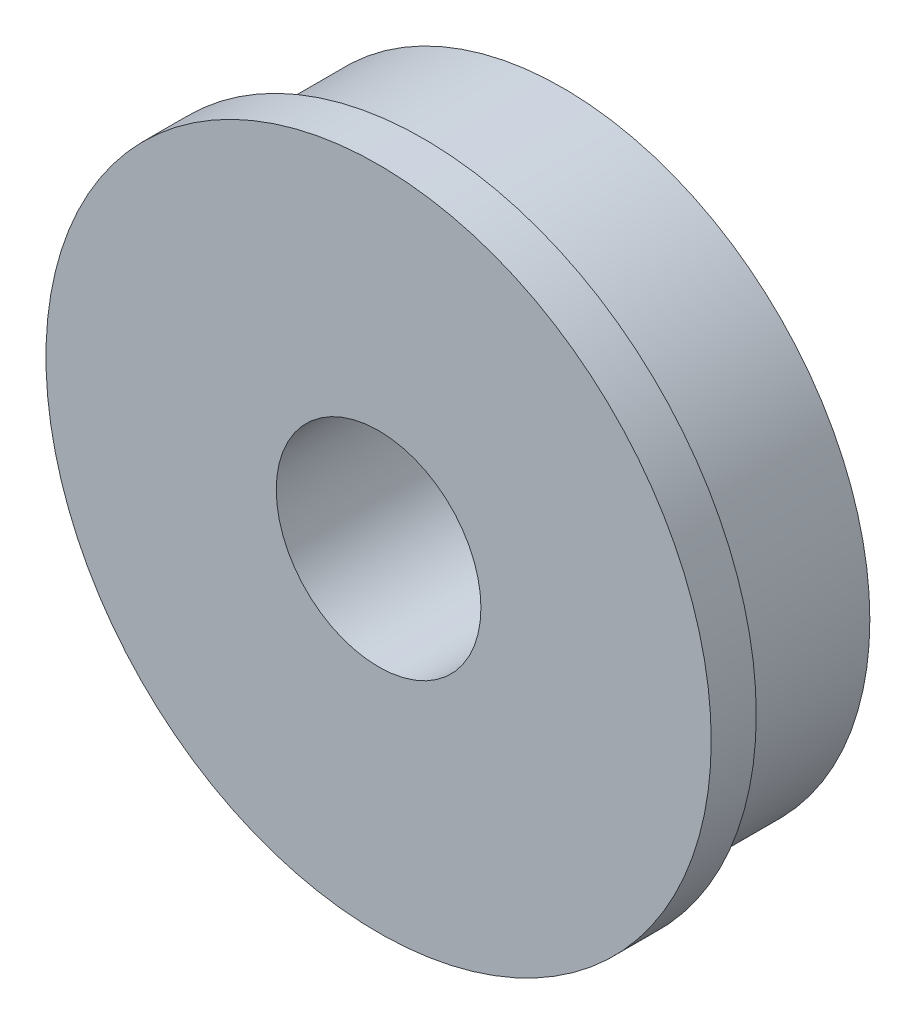
ISO-10303-21;
HEADER;
FILE_DESCRIPTION(('STEP AP214'),'2;1');
FILE_NAME('part.step','',(''),(''),'','','');
FILE_SCHEMA(('AUTOMOTIVE_DESIGN { 1 0 10303 214 1 1 1 1 }'));
ENDSEC;
DATA;
#1=APPLICATION_CONTEXT('core data for automotive mechanical design processes');
#2=APPLICATION_PROTOCOL_DEFINITION('international standard','automotive_design',2000,#1);
#3=PRODUCT_CONTEXT('',#1,'mechanical');
#4=PRODUCT('Part','Part','',(#3));
#5=PRODUCT_RELATED_PRODUCT_CATEGORY('part','',(#4));
#6=PRODUCT_DEFINITION_FORMATION('','',#4);
#7=PRODUCT_DEFINITION_CONTEXT('part definition',#1,'design');
#8=PRODUCT_DEFINITION('design','',#6,#7);
#9=PRODUCT_DEFINITION_SHAPE('','',#8);
#10=(LENGTH_UNIT() NAMED_UNIT(*) SI_UNIT(.MILLI.,.METRE.));
#11=(NAMED_UNIT(*) PLANE_ANGLE_UNIT() SI_UNIT($,.RADIAN.));
#12=(NAMED_UNIT(*) SI_UNIT($,.STERADIAN.) SOLID_ANGLE_UNIT());
#13=UNCERTAINTY_MEASURE_WITH_UNIT(LENGTH_MEASURE(1.E-05),#10,'distance_accuracy_value','');
#14=(GEOMETRIC_REPRESENTATION_CONTEXT(3) GLOBAL_UNCERTAINTY_ASSIGNED_CONTEXT((#13)) GLOBAL_UNIT_ASSIGNED_CONTEXT((#10,
#11,#12)) REPRESENTATION_CONTEXT('',''));
#15=CARTESIAN_POINT('',(0.,0.,0.));
#16=DIRECTION('',(0.,0.,1.));
#17=DIRECTION('',(1.,0.,0.));
#18=AXIS2_PLACEMENT_3D('',#15,#16,#17);
#19=CARTESIAN_POINT('',(0.,0.,0.));
#20=DIRECTION('',(0.,0.,1.));
#21=DIRECTION('',(1.,0.,0.));
#22=AXIS2_PLACEMENT_3D('',#19,#20,#21);
#23=PLANE('',#22);
#24=CARTESIAN_POINT('',(0.,0.,0.));
#25=DIRECTION('',(0.,0.,1.));
#26=DIRECTION('',(1.,0.,0.));
#27=AXIS2_PLACEMENT_3D('',#24,#25,#26);
#28=CIRCLE('',#27,15.);
#29=CARTESIAN_POINT('',(15.,0.,0.));
#30=VERTEX_POINT('',#29);
#31=EDGE_CURVE('E36',#30,#30,#28,.T.);
#32=ORIENTED_EDGE('',*,*,#31,.F.);
#33=EDGE_LOOP('',(#32));
#34=FACE_BOUND('',#33,.T.);
#35=CARTESIAN_POINT('',(0.,0.,0.));
#36=DIRECTION('',(0.,0.,1.));
#37=DIRECTION('',(1.,0.,0.));
#38=AXIS2_PLACEMENT_3D('',#35,#36,#37);
#39=CIRCLE('',#38,5.);
#40=CARTESIAN_POINT('',(5.,0.,0.));
#41=VERTEX_POINT('',#40);
#42=EDGE_CURVE('E43',#41,#41,#39,.T.);
#43=ORIENTED_EDGE('',*,*,#42,.T.);
#44=EDGE_LOOP('',(#43));
#45=FACE_BOUND('',#44,.T.);
#46=ADVANCED_FACE('F32',(#34,#45),#23,.F.);
#47=CARTESIAN_POINT('',(0.,0.,6.8));
#48=DIRECTION('',(0.,0.,-1.));
#49=DIRECTION('',(-1.,0.,0.));
#50=AXIS2_PLACEMENT_3D('',#47,#48,#49);
#51=CYLINDRICAL_SURFACE('',#50,15.);
#52=CARTESIAN_POINT('',(0.,0.,6.8));
#53=DIRECTION('',(0.,0.,1.));
#54=DIRECTION('',(1.,0.,0.));
#55=AXIS2_PLACEMENT_3D('',#52,#53,#54);
#56=CIRCLE('',#55,15.);
#57=CARTESIAN_POINT('',(15.,0.,6.8));
#58=VERTEX_POINT('',#57);
#59=EDGE_CURVE('E10',#58,#58,#56,.T.);
#60=ORIENTED_EDGE('',*,*,#59,.F.);
#61=EDGE_LOOP('',(#60));
#62=FACE_BOUND('',#61,.T.);
#63=ORIENTED_EDGE('',*,*,#31,.T.);
#64=EDGE_LOOP('',(#63));
#65=FACE_BOUND('',#64,.T.);
#66=ADVANCED_FACE('F34',(#62,#65),#51,.T.);
#67=CARTESIAN_POINT('',(0.,0.,6.8));
#68=DIRECTION('',(0.,0.,-1.));
#69=DIRECTION('',(-1.,0.,0.));
#70=AXIS2_PLACEMENT_3D('',#67,#68,#69);
#71=CYLINDRICAL_SURFACE('',#70,5.);
#72=ORIENTED_EDGE('',*,*,#42,.F.);
#73=EDGE_LOOP('',(#72));
#74=FACE_BOUND('',#73,.T.);
#75=CARTESIAN_POINT('',(0.,0.,9.));
#76=DIRECTION('',(0.,0.,1.));
#77=DIRECTION('',(1.,0.,0.));
#78=AXIS2_PLACEMENT_3D('',#75,#76,#77);
#79=CIRCLE('',#78,5.);
#80=CARTESIAN_POINT('',(5.,0.,9.));
#81=VERTEX_POINT('',#80);
#82=EDGE_CURVE('E51',#81,#81,#79,.T.);
#83=ORIENTED_EDGE('',*,*,#82,.T.);
#84=EDGE_LOOP('',(#83));
#85=FACE_BOUND('',#84,.T.);
#86=ADVANCED_FACE('F57',(#74,#85),#71,.F.);
#87=CARTESIAN_POINT('',(0.,0.,9.));
#88=DIRECTION('',(0.,0.,1.));
#89=DIRECTION('',(1.,0.,0.));
#90=AXIS2_PLACEMENT_3D('',#87,#88,#89);
#91=PLANE('',#90);
#92=CARTESIAN_POINT('',(0.,0.,9.));
#93=DIRECTION('',(0.,0.,1.));
#94=DIRECTION('',(1.,0.,0.));
#95=AXIS2_PLACEMENT_3D('',#92,#93,#94);
#96=CIRCLE('',#95,16.25);
#97=CARTESIAN_POINT('',(16.25,0.,9.));
#98=VERTEX_POINT('',#97);
#99=EDGE_CURVE('E47',#98,#98,#96,.T.);
#100=ORIENTED_EDGE('',*,*,#99,.T.);
#101=EDGE_LOOP('',(#100));
#102=FACE_BOUND('',#101,.T.);
#103=ORIENTED_EDGE('',*,*,#82,.F.);
#104=EDGE_LOOP('',(#103));
#105=FACE_BOUND('',#104,.T.);
#106=ADVANCED_FACE('F59',(#102,#105),#91,.T.);
#107=CARTESIAN_POINT('',(0.,0.,6.8));
#108=DIRECTION('',(0.,0.,1.));
#109=DIRECTION('',(1.,0.,0.));
#110=AXIS2_PLACEMENT_3D('',#107,#108,#109);
#111=PLANE('',#110);
#112=ORIENTED_EDGE('',*,*,#59,.T.);
#113=EDGE_LOOP('',(#112));
#114=FACE_BOUND('',#113,.T.);
#115=CARTESIAN_POINT('',(0.,0.,6.8));
#116=DIRECTION('',(0.,0.,1.));
#117=DIRECTION('',(1.,0.,0.));
#118=AXIS2_PLACEMENT_3D('',#115,#116,#117);
#119=CIRCLE('',#118,16.25);
#120=CARTESIAN_POINT('',(16.25,0.,6.8));
#121=VERTEX_POINT('',#120);
#122=EDGE_CURVE('E48',#121,#121,#119,.T.);
#123=ORIENTED_EDGE('',*,*,#122,.F.);
#124=EDGE_LOOP('',(#123));
#125=FACE_BOUND('',#124,.T.);
#126=ADVANCED_FACE('F61',(#114,#125),#111,.F.);
#127=CARTESIAN_POINT('',(0.,0.,9.));
#128=DIRECTION('',(0.,0.,-1.));
#129=DIRECTION('',(-1.,0.,0.));
#130=AXIS2_PLACEMENT_3D('',#127,#128,#129);
#131=CYLINDRICAL_SURFACE('',#130,16.25);
#132=ORIENTED_EDGE('',*,*,#99,.F.);
#133=EDGE_LOOP('',(#132));
#134=FACE_BOUND('',#133,.T.);
#135=ORIENTED_EDGE('',*,*,#122,.T.);
#136=EDGE_LOOP('',(#135));
#137=FACE_BOUND('',#136,.T.);
#138=ADVANCED_FACE('F68',(#134,#137),#131,.T.);
#139=CLOSED_SHELL('',(#46,#66,#86,#106,#126,#138));
#140=MANIFOLD_SOLID_BREP('B2',#139);
#141=ADVANCED_BREP_SHAPE_REPRESENTATION('',(#18,#140),#14);
#142=SHAPE_DEFINITION_REPRESENTATION(#9,#141);
ENDSEC;
END-ISO-10303-21;
